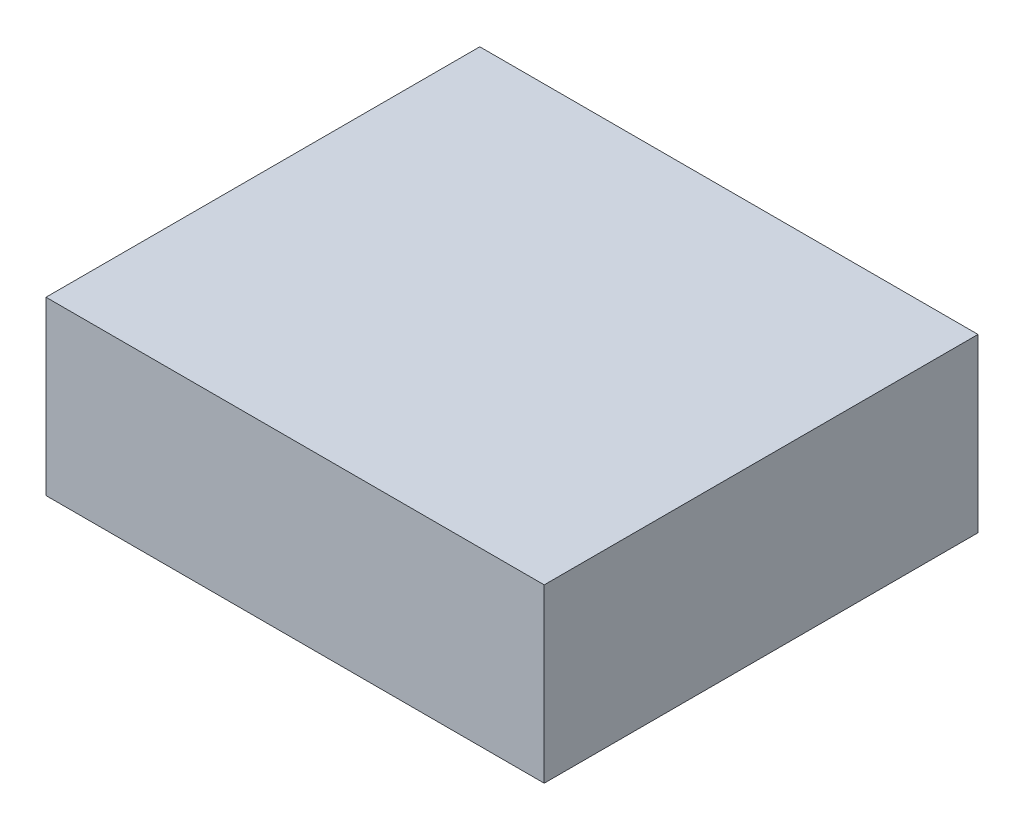
ISO-10303-21;
HEADER;
FILE_DESCRIPTION(('STEP AP214'),'2;1');
FILE_NAME('part.step','',(''),(''),'','','');
FILE_SCHEMA(('AUTOMOTIVE_DESIGN { 1 0 10303 214 1 1 1 1 }'));
ENDSEC;
DATA;
#1=APPLICATION_CONTEXT('core data for automotive mechanical design processes');
#2=APPLICATION_PROTOCOL_DEFINITION('international standard','automotive_design',2000,#1);
#3=PRODUCT_CONTEXT('',#1,'mechanical');
#4=PRODUCT('Part','Part','',(#3));
#5=PRODUCT_RELATED_PRODUCT_CATEGORY('part','',(#4));
#6=PRODUCT_DEFINITION_FORMATION('','',#4);
#7=PRODUCT_DEFINITION_CONTEXT('part definition',#1,'design');
#8=PRODUCT_DEFINITION('design','',#6,#7);
#9=PRODUCT_DEFINITION_SHAPE('','',#8);
#10=(LENGTH_UNIT() NAMED_UNIT(*) SI_UNIT(.MILLI.,.METRE.));
#11=(NAMED_UNIT(*) PLANE_ANGLE_UNIT() SI_UNIT($,.RADIAN.));
#12=(NAMED_UNIT(*) SI_UNIT($,.STERADIAN.) SOLID_ANGLE_UNIT());
#13=UNCERTAINTY_MEASURE_WITH_UNIT(LENGTH_MEASURE(1.E-05),#10,'distance_accuracy_value','');
#14=(GEOMETRIC_REPRESENTATION_CONTEXT(3) GLOBAL_UNCERTAINTY_ASSIGNED_CONTEXT((#13)) GLOBAL_UNIT_ASSIGNED_CONTEXT((#10,
#11,#12)) REPRESENTATION_CONTEXT('',''));
#15=CARTESIAN_POINT('',(0.,0.,0.));
#16=DIRECTION('',(0.,0.,1.));
#17=DIRECTION('',(1.,0.,0.));
#18=AXIS2_PLACEMENT_3D('',#15,#16,#17);
#19=CARTESIAN_POINT('',(0.,0.,0.));
#20=DIRECTION('',(0.,1.,0.));
#21=DIRECTION('',(0.,0.,1.));
#22=AXIS2_PLACEMENT_3D('',#19,#20,#21);
#23=PLANE('',#22);
#24=DIRECTION('',(-1.,0.,0.));
#25=VECTOR('',#24,1.);
#26=CARTESIAN_POINT('',(2.8,0.,1.25));
#27=LINE('',#26,#25);
#28=CARTESIAN_POINT('',(5.8,0.,1.25));
#29=VERTEX_POINT('',#28);
#30=CARTESIAN_POINT('',(2.8,0.,1.25));
#31=VERTEX_POINT('',#30);
#32=EDGE_CURVE('E138',#29,#31,#27,.T.);
#33=ORIENTED_EDGE('',*,*,#32,.F.);
#34=DIRECTION('',(0.,0.,-1.));
#35=VECTOR('',#34,1.);
#36=CARTESIAN_POINT('',(5.8,0.,-5.05));
#37=LINE('',#36,#35);
#38=CARTESIAN_POINT('',(5.8,0.,5.05));
#39=VERTEX_POINT('',#38);
#40=EDGE_CURVE('E198',#39,#29,#37,.T.);
#41=ORIENTED_EDGE('',*,*,#40,.F.);
#42=DIRECTION('',(1.,0.,0.));
#43=VECTOR('',#42,1.);
#44=CARTESIAN_POINT('',(-5.8,0.,5.05));
#45=LINE('',#44,#43);
#46=CARTESIAN_POINT('',(-5.8,0.,5.05));
#47=VERTEX_POINT('',#46);
#48=EDGE_CURVE('E191',#47,#39,#45,.T.);
#49=ORIENTED_EDGE('',*,*,#48,.F.);
#50=DIRECTION('',(0.,0.,1.));
#51=VECTOR('',#50,1.);
#52=CARTESIAN_POINT('',(-5.8,0.,-5.05));
#53=LINE('',#52,#51);
#54=CARTESIAN_POINT('',(-5.8,0.,1.25));
#55=VERTEX_POINT('',#54);
#56=EDGE_CURVE('E203',#55,#47,#53,.T.);
#57=ORIENTED_EDGE('',*,*,#56,.F.);
#58=DIRECTION('',(-1.,0.,0.));
#59=VECTOR('',#58,1.);
#60=CARTESIAN_POINT('',(-5.8,0.,1.25));
#61=LINE('',#60,#59);
#62=CARTESIAN_POINT('',(-2.8,0.,1.25));
#63=VERTEX_POINT('',#62);
#64=EDGE_CURVE('E172',#63,#55,#61,.T.);
#65=ORIENTED_EDGE('',*,*,#64,.F.);
#66=DIRECTION('',(0.,0.,1.));
#67=VECTOR('',#66,1.);
#68=CARTESIAN_POINT('',(-2.8,0.,1.25));
#69=LINE('',#68,#67);
#70=CARTESIAN_POINT('',(-2.8,0.,-1.25));
#71=VERTEX_POINT('',#70);
#72=EDGE_CURVE('E60',#71,#63,#69,.T.);
#73=ORIENTED_EDGE('',*,*,#72,.F.);
#74=DIRECTION('',(1.,0.,0.));
#75=VECTOR('',#74,1.);
#76=CARTESIAN_POINT('',(-5.8,0.,-1.25));
#77=LINE('',#76,#75);
#78=CARTESIAN_POINT('',(-5.8,0.,-1.25));
#79=VERTEX_POINT('',#78);
#80=EDGE_CURVE('E164',#79,#71,#77,.T.);
#81=ORIENTED_EDGE('',*,*,#80,.F.);
#82=CARTESIAN_POINT('',(-5.8,0.,-5.05));
#83=VERTEX_POINT('',#82);
#84=EDGE_CURVE('E204',#83,#79,#53,.T.);
#85=ORIENTED_EDGE('',*,*,#84,.F.);
#86=DIRECTION('',(-1.,0.,0.));
#87=VECTOR('',#86,1.);
#88=CARTESIAN_POINT('',(-5.8,0.,-5.05));
#89=LINE('',#88,#87);
#90=CARTESIAN_POINT('',(5.8,0.,-5.05));
#91=VERTEX_POINT('',#90);
#92=EDGE_CURVE('E201',#91,#83,#89,.T.);
#93=ORIENTED_EDGE('',*,*,#92,.F.);
#94=CARTESIAN_POINT('',(5.8,0.,-1.25));
#95=VERTEX_POINT('',#94);
#96=EDGE_CURVE('E147',#95,#91,#37,.T.);
#97=ORIENTED_EDGE('',*,*,#96,.F.);
#98=DIRECTION('',(1.,0.,0.));
#99=VECTOR('',#98,1.);
#100=CARTESIAN_POINT('',(2.8,0.,-1.25));
#101=LINE('',#100,#99);
#102=CARTESIAN_POINT('',(2.8,0.,-1.25));
#103=VERTEX_POINT('',#102);
#104=EDGE_CURVE('E139',#103,#95,#101,.T.);
#105=ORIENTED_EDGE('',*,*,#104,.F.);
#106=DIRECTION('',(0.,0.,-1.));
#107=VECTOR('',#106,1.);
#108=CARTESIAN_POINT('',(2.8,0.,1.25));
#109=LINE('',#108,#107);
#110=EDGE_CURVE('E128',#31,#103,#109,.T.);
#111=ORIENTED_EDGE('',*,*,#110,.F.);
#112=EDGE_LOOP('',(#33,#41,#49,#57,#65,#73,#81,#85,#93,#97,#105,#111));
#113=FACE_BOUND('',#112,.T.);
#114=ADVANCED_FACE('F37',(#113),#23,.F.);
#115=CARTESIAN_POINT('',(5.8,4.,-5.05));
#116=DIRECTION('',(-1.,0.,0.));
#117=DIRECTION('',(0.,0.,1.));
#118=AXIS2_PLACEMENT_3D('',#115,#116,#117);
#119=PLANE('',#118);
#120=ORIENTED_EDGE('',*,*,#40,.T.);
#121=DIRECTION('',(0.,1.,0.));
#122=VECTOR('',#121,1.);
#123=CARTESIAN_POINT('',(5.8,-0.0001,1.25));
#124=LINE('',#123,#122);
#125=CARTESIAN_POINT('',(5.8,-0.0001,1.25));
#126=VERTEX_POINT('',#125);
#127=EDGE_CURVE('E289',#126,#29,#124,.T.);
#128=ORIENTED_EDGE('',*,*,#127,.F.);
#129=DIRECTION('',(0.,0.,1.));
#130=VECTOR('',#129,1.);
#131=CARTESIAN_POINT('',(5.8,-0.0001,1.25));
#132=LINE('',#131,#130);
#133=CARTESIAN_POINT('',(5.8,-0.0001,-1.25));
#134=VERTEX_POINT('',#133);
#135=EDGE_CURVE('E148',#134,#126,#132,.T.);
#136=ORIENTED_EDGE('',*,*,#135,.F.);
#137=DIRECTION('',(0.,1.,0.));
#138=VECTOR('',#137,1.);
#139=CARTESIAN_POINT('',(5.8,-0.0001,-1.25));
#140=LINE('',#139,#138);
#141=EDGE_CURVE('E52',#134,#95,#140,.T.);
#142=ORIENTED_EDGE('',*,*,#141,.T.);
#143=ORIENTED_EDGE('',*,*,#96,.T.);
#144=DIRECTION('',(0.,-1.,0.));
#145=VECTOR('',#144,1.);
#146=CARTESIAN_POINT('',(5.8,4.,-5.05));
#147=LINE('',#146,#145);
#148=CARTESIAN_POINT('',(5.8,4.,-5.05));
#149=VERTEX_POINT('',#148);
#150=EDGE_CURVE('E11',#149,#91,#147,.T.);
#151=ORIENTED_EDGE('',*,*,#150,.F.);
#152=DIRECTION('',(0.,0.,-1.));
#153=VECTOR('',#152,1.);
#154=CARTESIAN_POINT('',(5.8,4.,-5.05));
#155=LINE('',#154,#153);
#156=CARTESIAN_POINT('',(5.8,4.,5.05));
#157=VERTEX_POINT('',#156);
#158=EDGE_CURVE('E187',#157,#149,#155,.T.);
#159=ORIENTED_EDGE('',*,*,#158,.F.);
#160=DIRECTION('',(0.,-1.,0.));
#161=VECTOR('',#160,1.);
#162=CARTESIAN_POINT('',(5.8,4.,5.05));
#163=LINE('',#162,#161);
#164=EDGE_CURVE('E197',#157,#39,#163,.T.);
#165=ORIENTED_EDGE('',*,*,#164,.T.);
#166=EDGE_LOOP('',(#120,#128,#136,#142,#143,#151,#159,#165));
#167=FACE_BOUND('',#166,.T.);
#168=ADVANCED_FACE('F39',(#167),#119,.F.);
#169=CARTESIAN_POINT('',(-5.8,4.,-5.05));
#170=DIRECTION('',(0.,0.,1.));
#171=DIRECTION('',(1.,0.,0.));
#172=AXIS2_PLACEMENT_3D('',#169,#170,#171);
#173=PLANE('',#172);
#174=ORIENTED_EDGE('',*,*,#92,.T.);
#175=DIRECTION('',(0.,-1.,0.));
#176=VECTOR('',#175,1.);
#177=CARTESIAN_POINT('',(-5.8,4.,-5.05));
#178=LINE('',#177,#176);
#179=CARTESIAN_POINT('',(-5.8,4.,-5.05));
#180=VERTEX_POINT('',#179);
#181=EDGE_CURVE('E45',#180,#83,#178,.T.);
#182=ORIENTED_EDGE('',*,*,#181,.F.);
#183=DIRECTION('',(-1.,0.,0.));
#184=VECTOR('',#183,1.);
#185=CARTESIAN_POINT('',(-5.8,4.,-5.05));
#186=LINE('',#185,#184);
#187=EDGE_CURVE('E190',#149,#180,#186,.T.);
#188=ORIENTED_EDGE('',*,*,#187,.F.);
#189=ORIENTED_EDGE('',*,*,#150,.T.);
#190=EDGE_LOOP('',(#174,#182,#188,#189));
#191=FACE_BOUND('',#190,.T.);
#192=ADVANCED_FACE('F246',(#191),#173,.F.);
#193=CARTESIAN_POINT('',(-5.8,4.,-5.05));
#194=DIRECTION('',(1.,0.,0.));
#195=DIRECTION('',(0.,0.,-1.));
#196=AXIS2_PLACEMENT_3D('',#193,#194,#195);
#197=PLANE('',#196);
#198=ORIENTED_EDGE('',*,*,#84,.T.);
#199=DIRECTION('',(0.,1.,0.));
#200=VECTOR('',#199,1.);
#201=CARTESIAN_POINT('',(-5.8,-0.0001,-1.25));
#202=LINE('',#201,#200);
#203=CARTESIAN_POINT('',(-5.8,-0.0001,-1.25));
#204=VERTEX_POINT('',#203);
#205=EDGE_CURVE('E178',#204,#79,#202,.T.);
#206=ORIENTED_EDGE('',*,*,#205,.F.);
#207=DIRECTION('',(0.,0.,-1.));
#208=VECTOR('',#207,1.);
#209=CARTESIAN_POINT('',(-5.8,-0.0001,1.25));
#210=LINE('',#209,#208);
#211=CARTESIAN_POINT('',(-5.8,-0.0001,1.25));
#212=VERTEX_POINT('',#211);
#213=EDGE_CURVE('E166',#212,#204,#210,.T.);
#214=ORIENTED_EDGE('',*,*,#213,.F.);
#215=DIRECTION('',(0.,1.,0.));
#216=VECTOR('',#215,1.);
#217=CARTESIAN_POINT('',(-5.8,-0.0001,1.25));
#218=LINE('',#217,#216);
#219=EDGE_CURVE('E181',#212,#55,#218,.T.);
#220=ORIENTED_EDGE('',*,*,#219,.T.);
#221=ORIENTED_EDGE('',*,*,#56,.T.);
#222=DIRECTION('',(0.,-1.,0.));
#223=VECTOR('',#222,1.);
#224=CARTESIAN_POINT('',(-5.8,4.,5.05));
#225=LINE('',#224,#223);
#226=CARTESIAN_POINT('',(-5.8,4.,5.05));
#227=VERTEX_POINT('',#226);
#228=EDGE_CURVE('E210',#227,#47,#225,.T.);
#229=ORIENTED_EDGE('',*,*,#228,.F.);
#230=DIRECTION('',(0.,0.,1.));
#231=VECTOR('',#230,1.);
#232=CARTESIAN_POINT('',(-5.8,4.,-5.05));
#233=LINE('',#232,#231);
#234=EDGE_CURVE('E193',#180,#227,#233,.T.);
#235=ORIENTED_EDGE('',*,*,#234,.F.);
#236=ORIENTED_EDGE('',*,*,#181,.T.);
#237=EDGE_LOOP('',(#198,#206,#214,#220,#221,#229,#235,#236));
#238=FACE_BOUND('',#237,.T.);
#239=ADVANCED_FACE('F217',(#238),#197,.F.);
#240=CARTESIAN_POINT('',(-5.8,4.,5.05));
#241=DIRECTION('',(0.,0.,-1.));
#242=DIRECTION('',(-1.,0.,0.));
#243=AXIS2_PLACEMENT_3D('',#240,#241,#242);
#244=PLANE('',#243);
#245=ORIENTED_EDGE('',*,*,#48,.T.);
#246=ORIENTED_EDGE('',*,*,#164,.F.);
#247=DIRECTION('',(1.,0.,0.));
#248=VECTOR('',#247,1.);
#249=CARTESIAN_POINT('',(-5.8,4.,5.05));
#250=LINE('',#249,#248);
#251=EDGE_CURVE('E195',#227,#157,#250,.T.);
#252=ORIENTED_EDGE('',*,*,#251,.F.);
#253=ORIENTED_EDGE('',*,*,#228,.T.);
#254=EDGE_LOOP('',(#245,#246,#252,#253));
#255=FACE_BOUND('',#254,.T.);
#256=ADVANCED_FACE('F239',(#255),#244,.F.);
#257=CARTESIAN_POINT('',(0.,4.,0.));
#258=DIRECTION('',(0.,1.,0.));
#259=DIRECTION('',(0.,0.,1.));
#260=AXIS2_PLACEMENT_3D('',#257,#258,#259);
#261=PLANE('',#260);
#262=ORIENTED_EDGE('',*,*,#158,.T.);
#263=ORIENTED_EDGE('',*,*,#187,.T.);
#264=ORIENTED_EDGE('',*,*,#234,.T.);
#265=ORIENTED_EDGE('',*,*,#251,.T.);
#266=EDGE_LOOP('',(#262,#263,#264,#265));
#267=FACE_BOUND('',#266,.T.);
#268=ADVANCED_FACE('F245',(#267),#261,.T.);
#269=CARTESIAN_POINT('',(-2.8,-0.0001,1.25));
#270=DIRECTION('',(-1.,0.,0.));
#271=DIRECTION('',(0.,0.,1.));
#272=AXIS2_PLACEMENT_3D('',#269,#270,#271);
#273=PLANE('',#272);
#274=ORIENTED_EDGE('',*,*,#72,.T.);
#275=DIRECTION('',(0.,1.,0.));
#276=VECTOR('',#275,1.);
#277=CARTESIAN_POINT('',(-2.8,-0.0001,1.25));
#278=LINE('',#277,#276);
#279=CARTESIAN_POINT('',(-2.8,-0.0001,1.25));
#280=VERTEX_POINT('',#279);
#281=EDGE_CURVE('E184',#280,#63,#278,.T.);
#282=ORIENTED_EDGE('',*,*,#281,.F.);
#283=DIRECTION('',(0.,0.,1.));
#284=VECTOR('',#283,1.);
#285=CARTESIAN_POINT('',(-2.8,-0.0001,1.25));
#286=LINE('',#285,#284);
#287=CARTESIAN_POINT('',(-2.8,-0.0001,-1.25));
#288=VERTEX_POINT('',#287);
#289=EDGE_CURVE('E160',#288,#280,#286,.T.);
#290=ORIENTED_EDGE('',*,*,#289,.F.);
#291=DIRECTION('',(0.,1.,0.));
#292=VECTOR('',#291,1.);
#293=CARTESIAN_POINT('',(-2.8,-0.0001,-1.25));
#294=LINE('',#293,#292);
#295=EDGE_CURVE('E170',#288,#71,#294,.T.);
#296=ORIENTED_EDGE('',*,*,#295,.T.);
#297=EDGE_LOOP('',(#274,#282,#290,#296));
#298=FACE_BOUND('',#297,.T.);
#299=ADVANCED_FACE('F227',(#298),#273,.F.);
#300=CARTESIAN_POINT('',(-5.8,-0.0001,1.25));
#301=DIRECTION('',(0.,0.,-1.));
#302=DIRECTION('',(-1.,0.,0.));
#303=AXIS2_PLACEMENT_3D('',#300,#301,#302);
#304=PLANE('',#303);
#305=ORIENTED_EDGE('',*,*,#64,.T.);
#306=ORIENTED_EDGE('',*,*,#219,.F.);
#307=DIRECTION('',(-1.,0.,0.));
#308=VECTOR('',#307,1.);
#309=CARTESIAN_POINT('',(-5.8,-0.0001,1.25));
#310=LINE('',#309,#308);
#311=EDGE_CURVE('E163',#280,#212,#310,.T.);
#312=ORIENTED_EDGE('',*,*,#311,.F.);
#313=ORIENTED_EDGE('',*,*,#281,.T.);
#314=EDGE_LOOP('',(#305,#306,#312,#313));
#315=FACE_BOUND('',#314,.T.);
#316=ADVANCED_FACE('F234',(#315),#304,.F.);
#317=CARTESIAN_POINT('',(-5.8,-0.0001,-1.25));
#318=DIRECTION('',(0.,0.,1.));
#319=DIRECTION('',(1.,0.,0.));
#320=AXIS2_PLACEMENT_3D('',#317,#318,#319);
#321=PLANE('',#320);
#322=ORIENTED_EDGE('',*,*,#80,.T.);
#323=ORIENTED_EDGE('',*,*,#295,.F.);
#324=DIRECTION('',(1.,0.,0.));
#325=VECTOR('',#324,1.);
#326=CARTESIAN_POINT('',(-5.8,-0.0001,-1.25));
#327=LINE('',#326,#325);
#328=EDGE_CURVE('E168',#204,#288,#327,.T.);
#329=ORIENTED_EDGE('',*,*,#328,.F.);
#330=ORIENTED_EDGE('',*,*,#205,.T.);
#331=EDGE_LOOP('',(#322,#323,#329,#330));
#332=FACE_BOUND('',#331,.T.);
#333=ADVANCED_FACE('F223',(#332),#321,.F.);
#334=CARTESIAN_POINT('',(0.,-0.0001,0.));
#335=DIRECTION('',(0.,-1.,0.));
#336=DIRECTION('',(0.,0.,-1.));
#337=AXIS2_PLACEMENT_3D('',#334,#335,#336);
#338=PLANE('',#337);
#339=ORIENTED_EDGE('',*,*,#289,.T.);
#340=ORIENTED_EDGE('',*,*,#311,.T.);
#341=ORIENTED_EDGE('',*,*,#213,.T.);
#342=ORIENTED_EDGE('',*,*,#328,.T.);
#343=EDGE_LOOP('',(#339,#340,#341,#342));
#344=FACE_BOUND('',#343,.T.);
#345=ADVANCED_FACE('F230',(#344),#338,.T.);
#346=CARTESIAN_POINT('',(2.8,-0.0001,1.25));
#347=DIRECTION('',(0.,0.,-1.));
#348=DIRECTION('',(-1.,0.,0.));
#349=AXIS2_PLACEMENT_3D('',#346,#347,#348);
#350=PLANE('',#349);
#351=ORIENTED_EDGE('',*,*,#32,.T.);
#352=DIRECTION('',(0.,1.,0.));
#353=VECTOR('',#352,1.);
#354=CARTESIAN_POINT('',(2.8,-0.0001,1.25));
#355=LINE('',#354,#353);
#356=CARTESIAN_POINT('',(2.8,-0.0001,1.25));
#357=VERTEX_POINT('',#356);
#358=EDGE_CURVE('E135',#357,#31,#355,.T.);
#359=ORIENTED_EDGE('',*,*,#358,.F.);
#360=DIRECTION('',(-1.,0.,0.));
#361=VECTOR('',#360,1.);
#362=CARTESIAN_POINT('',(2.8,-0.0001,1.25));
#363=LINE('',#362,#361);
#364=EDGE_CURVE('E151',#126,#357,#363,.T.);
#365=ORIENTED_EDGE('',*,*,#364,.F.);
#366=ORIENTED_EDGE('',*,*,#127,.T.);
#367=EDGE_LOOP('',(#351,#359,#365,#366));
#368=FACE_BOUND('',#367,.T.);
#369=ADVANCED_FACE('F276',(#368),#350,.F.);
#370=CARTESIAN_POINT('',(2.8,-0.0001,1.25));
#371=DIRECTION('',(1.,0.,0.));
#372=DIRECTION('',(0.,0.,-1.));
#373=AXIS2_PLACEMENT_3D('',#370,#371,#372);
#374=PLANE('',#373);
#375=ORIENTED_EDGE('',*,*,#110,.T.);
#376=DIRECTION('',(0.,1.,0.));
#377=VECTOR('',#376,1.);
#378=CARTESIAN_POINT('',(2.8,-0.0001,-1.25));
#379=LINE('',#378,#377);
#380=CARTESIAN_POINT('',(2.8,-0.0001,-1.25));
#381=VERTEX_POINT('',#380);
#382=EDGE_CURVE('E132',#381,#103,#379,.T.);
#383=ORIENTED_EDGE('',*,*,#382,.F.);
#384=DIRECTION('',(0.,0.,-1.));
#385=VECTOR('',#384,1.);
#386=CARTESIAN_POINT('',(2.8,-0.0001,1.25));
#387=LINE('',#386,#385);
#388=EDGE_CURVE('E157',#357,#381,#387,.T.);
#389=ORIENTED_EDGE('',*,*,#388,.F.);
#390=ORIENTED_EDGE('',*,*,#358,.T.);
#391=EDGE_LOOP('',(#375,#383,#389,#390));
#392=FACE_BOUND('',#391,.T.);
#393=ADVANCED_FACE('F130',(#392),#374,.F.);
#394=CARTESIAN_POINT('',(2.8,-0.0001,-1.25));
#395=DIRECTION('',(0.,0.,1.));
#396=DIRECTION('',(1.,0.,0.));
#397=AXIS2_PLACEMENT_3D('',#394,#395,#396);
#398=PLANE('',#397);
#399=ORIENTED_EDGE('',*,*,#104,.T.);
#400=ORIENTED_EDGE('',*,*,#141,.F.);
#401=DIRECTION('',(1.,0.,0.));
#402=VECTOR('',#401,1.);
#403=CARTESIAN_POINT('',(2.8,-0.0001,-1.25));
#404=LINE('',#403,#402);
#405=EDGE_CURVE('E144',#381,#134,#404,.T.);
#406=ORIENTED_EDGE('',*,*,#405,.F.);
#407=ORIENTED_EDGE('',*,*,#382,.T.);
#408=EDGE_LOOP('',(#399,#400,#406,#407));
#409=FACE_BOUND('',#408,.T.);
#410=ADVANCED_FACE('F142',(#409),#398,.F.);
#411=CARTESIAN_POINT('',(0.,-0.0001,0.));
#412=DIRECTION('',(0.,-1.,0.));
#413=DIRECTION('',(0.,0.,-1.));
#414=AXIS2_PLACEMENT_3D('',#411,#412,#413);
#415=PLANE('',#414);
#416=ORIENTED_EDGE('',*,*,#135,.T.);
#417=ORIENTED_EDGE('',*,*,#364,.T.);
#418=ORIENTED_EDGE('',*,*,#388,.T.);
#419=ORIENTED_EDGE('',*,*,#405,.T.);
#420=EDGE_LOOP('',(#416,#417,#418,#419));
#421=FACE_BOUND('',#420,.T.);
#422=ADVANCED_FACE('F277',(#421),#415,.T.);
#423=CLOSED_SHELL('',(#114,#168,#192,#239,#256,#268,#299,#316,#333,#345,#369,#393,#410,#422));
#424=MANIFOLD_SOLID_BREP('B2',#423);
#425=ADVANCED_BREP_SHAPE_REPRESENTATION('',(#18,#424),#14);
#426=SHAPE_DEFINITION_REPRESENTATION(#9,#425);
ENDSEC;
END-ISO-10303-21;
